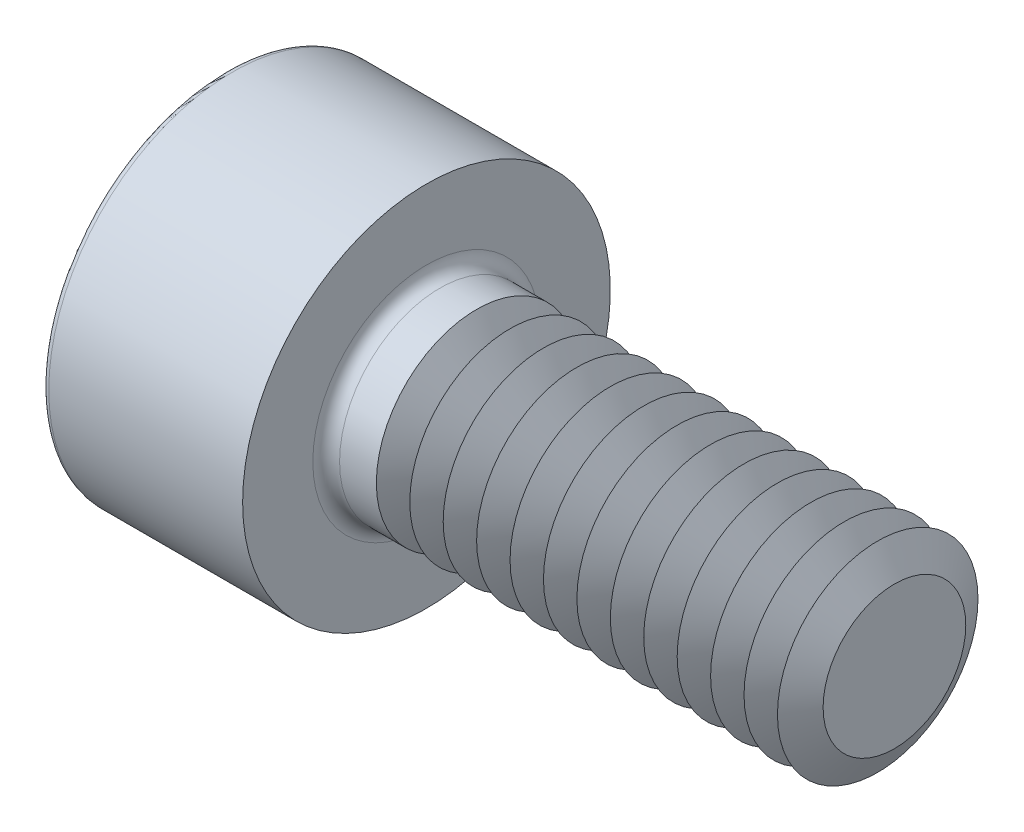
ISO-10303-21;
HEADER;
FILE_DESCRIPTION(('STEP AP214'),'2;1');
FILE_NAME('part.step','',(''),(''),'','','');
FILE_SCHEMA(('AUTOMOTIVE_DESIGN { 1 0 10303 214 1 1 1 1 }'));
ENDSEC;
DATA;
#1=APPLICATION_CONTEXT('core data for automotive mechanical design processes');
#2=APPLICATION_PROTOCOL_DEFINITION('international standard','automotive_design',2000,#1);
#3=PRODUCT_CONTEXT('',#1,'mechanical');
#4=PRODUCT('Part','Part','',(#3));
#5=PRODUCT_RELATED_PRODUCT_CATEGORY('part','',(#4));
#6=PRODUCT_DEFINITION_FORMATION('','',#4);
#7=PRODUCT_DEFINITION_CONTEXT('part definition',#1,'design');
#8=PRODUCT_DEFINITION('design','',#6,#7);
#9=PRODUCT_DEFINITION_SHAPE('','',#8);
#10=(LENGTH_UNIT() NAMED_UNIT(*) SI_UNIT(.MILLI.,.METRE.));
#11=(NAMED_UNIT(*) PLANE_ANGLE_UNIT() SI_UNIT($,.RADIAN.));
#12=(NAMED_UNIT(*) SI_UNIT($,.STERADIAN.) SOLID_ANGLE_UNIT());
#13=UNCERTAINTY_MEASURE_WITH_UNIT(LENGTH_MEASURE(1.E-05),#10,'distance_accuracy_value','');
#14=(GEOMETRIC_REPRESENTATION_CONTEXT(3) GLOBAL_UNCERTAINTY_ASSIGNED_CONTEXT((#13)) GLOBAL_UNIT_ASSIGNED_CONTEXT((#10,
#11,#12)) REPRESENTATION_CONTEXT('',''));
#15=CARTESIAN_POINT('',(0.,0.,0.));
#16=DIRECTION('',(0.,0.,1.));
#17=DIRECTION('',(1.,0.,0.));
#18=AXIS2_PLACEMENT_3D('',#15,#16,#17);
#19=CARTESIAN_POINT('',(0.,0.,0.));
#20=DIRECTION('',(-1.,0.,0.));
#21=DIRECTION('',(0.,0.,1.));
#22=AXIS2_PLACEMENT_3D('',#19,#20,#21);
#23=CYLINDRICAL_SURFACE('',#22,1.5);
#24=CARTESIAN_POINT('',(4.25000733344088,0.,0.));
#25=DIRECTION('',(-1.,0.,0.));
#26=DIRECTION('',(0.,0.,1.));
#27=AXIS2_PLACEMENT_3D('',#24,#25,#26);
#28=CIRCLE('',#27,1.5);
#29=CARTESIAN_POINT('',(4.25000733344088,0.,1.5));
#30=VERTEX_POINT('',#29);
#31=EDGE_CURVE('E332',#30,#30,#28,.T.);
#32=ORIENTED_EDGE('',*,*,#31,.T.);
#33=EDGE_LOOP('',(#32));
#34=FACE_BOUND('',#33,.T.);
#35=CARTESIAN_POINT('',(4.24999266655911,0.,0.));
#36=DIRECTION('',(-1.,0.,0.));
#37=DIRECTION('',(0.,0.,1.));
#38=AXIS2_PLACEMENT_3D('',#35,#36,#37);
#39=CIRCLE('',#38,1.5);
#40=CARTESIAN_POINT('',(4.24999266655911,0.,1.5));
#41=VERTEX_POINT('',#40);
#42=EDGE_CURVE('E328',#41,#41,#39,.T.);
#43=ORIENTED_EDGE('',*,*,#42,.F.);
#44=EDGE_LOOP('',(#43));
#45=FACE_BOUND('',#44,.T.);
#46=ADVANCED_FACE('F39',(#34,#45),#23,.T.);
#47=CARTESIAN_POINT('',(4.75000733344088,0.,0.));
#48=DIRECTION('',(-1.,0.,0.));
#49=DIRECTION('',(0.,0.,1.));
#50=AXIS2_PLACEMENT_3D('',#47,#48,#49);
#51=CIRCLE('',#50,1.5);
#52=CARTESIAN_POINT('',(4.75000733344088,0.,1.5));
#53=VERTEX_POINT('',#52);
#54=EDGE_CURVE('E345',#53,#53,#51,.T.);
#55=ORIENTED_EDGE('',*,*,#54,.T.);
#56=EDGE_LOOP('',(#55));
#57=FACE_BOUND('',#56,.T.);
#58=CARTESIAN_POINT('',(4.74999266655911,0.,0.));
#59=DIRECTION('',(-1.,0.,0.));
#60=DIRECTION('',(0.,0.,1.));
#61=AXIS2_PLACEMENT_3D('',#58,#59,#60);
#62=CIRCLE('',#61,1.5);
#63=CARTESIAN_POINT('',(4.74999266655911,0.,1.5));
#64=VERTEX_POINT('',#63);
#65=EDGE_CURVE('E334',#64,#64,#62,.T.);
#66=ORIENTED_EDGE('',*,*,#65,.F.);
#67=EDGE_LOOP('',(#66));
#68=FACE_BOUND('',#67,.T.);
#69=ADVANCED_FACE('F178',(#57,#68),#23,.T.);
#70=CARTESIAN_POINT('',(5.25000733344088,0.,0.));
#71=DIRECTION('',(-1.,0.,0.));
#72=DIRECTION('',(0.,0.,1.));
#73=AXIS2_PLACEMENT_3D('',#70,#71,#72);
#74=CIRCLE('',#73,1.5);
#75=CARTESIAN_POINT('',(5.25000733344088,0.,1.5));
#76=VERTEX_POINT('',#75);
#77=EDGE_CURVE('E354',#76,#76,#74,.T.);
#78=ORIENTED_EDGE('',*,*,#77,.T.);
#79=EDGE_LOOP('',(#78));
#80=FACE_BOUND('',#79,.T.);
#81=CARTESIAN_POINT('',(5.24999266655911,0.,0.));
#82=DIRECTION('',(-1.,0.,0.));
#83=DIRECTION('',(0.,0.,1.));
#84=AXIS2_PLACEMENT_3D('',#81,#82,#83);
#85=CIRCLE('',#84,1.5);
#86=CARTESIAN_POINT('',(5.24999266655911,0.,1.5));
#87=VERTEX_POINT('',#86);
#88=EDGE_CURVE('E348',#87,#87,#85,.T.);
#89=ORIENTED_EDGE('',*,*,#88,.F.);
#90=EDGE_LOOP('',(#89));
#91=FACE_BOUND('',#90,.T.);
#92=ADVANCED_FACE('F183',(#80,#91),#23,.T.);
#93=CARTESIAN_POINT('',(5.75000733344088,0.,0.));
#94=DIRECTION('',(-1.,0.,0.));
#95=DIRECTION('',(0.,0.,1.));
#96=AXIS2_PLACEMENT_3D('',#93,#94,#95);
#97=CIRCLE('',#96,1.5);
#98=CARTESIAN_POINT('',(5.75000733344088,0.,1.5));
#99=VERTEX_POINT('',#98);
#100=EDGE_CURVE('E363',#99,#99,#97,.T.);
#101=ORIENTED_EDGE('',*,*,#100,.T.);
#102=EDGE_LOOP('',(#101));
#103=FACE_BOUND('',#102,.T.);
#104=CARTESIAN_POINT('',(5.74999266655911,0.,0.));
#105=DIRECTION('',(-1.,0.,0.));
#106=DIRECTION('',(0.,0.,1.));
#107=AXIS2_PLACEMENT_3D('',#104,#105,#106);
#108=CIRCLE('',#107,1.5);
#109=CARTESIAN_POINT('',(5.74999266655911,0.,1.5));
#110=VERTEX_POINT('',#109);
#111=EDGE_CURVE('E357',#110,#110,#108,.T.);
#112=ORIENTED_EDGE('',*,*,#111,.F.);
#113=EDGE_LOOP('',(#112));
#114=FACE_BOUND('',#113,.T.);
#115=ADVANCED_FACE('F508',(#103,#114),#23,.T.);
#116=CARTESIAN_POINT('',(6.25000733344088,0.,0.));
#117=DIRECTION('',(-1.,0.,0.));
#118=DIRECTION('',(0.,0.,1.));
#119=AXIS2_PLACEMENT_3D('',#116,#117,#118);
#120=CIRCLE('',#119,1.5);
#121=CARTESIAN_POINT('',(6.25000733344088,0.,1.5));
#122=VERTEX_POINT('',#121);
#123=EDGE_CURVE('E372',#122,#122,#120,.T.);
#124=ORIENTED_EDGE('',*,*,#123,.T.);
#125=EDGE_LOOP('',(#124));
#126=FACE_BOUND('',#125,.T.);
#127=CARTESIAN_POINT('',(6.24999266655911,0.,0.));
#128=DIRECTION('',(-1.,0.,0.));
#129=DIRECTION('',(0.,0.,1.));
#130=AXIS2_PLACEMENT_3D('',#127,#128,#129);
#131=CIRCLE('',#130,1.5);
#132=CARTESIAN_POINT('',(6.24999266655911,0.,1.5));
#133=VERTEX_POINT('',#132);
#134=EDGE_CURVE('E366',#133,#133,#131,.T.);
#135=ORIENTED_EDGE('',*,*,#134,.F.);
#136=EDGE_LOOP('',(#135));
#137=FACE_BOUND('',#136,.T.);
#138=ADVANCED_FACE('F499',(#126,#137),#23,.T.);
#139=CARTESIAN_POINT('',(6.75000733344088,0.,0.));
#140=DIRECTION('',(-1.,0.,0.));
#141=DIRECTION('',(0.,0.,1.));
#142=AXIS2_PLACEMENT_3D('',#139,#140,#141);
#143=CIRCLE('',#142,1.5);
#144=CARTESIAN_POINT('',(6.75000733344088,0.,1.5));
#145=VERTEX_POINT('',#144);
#146=EDGE_CURVE('E381',#145,#145,#143,.T.);
#147=ORIENTED_EDGE('',*,*,#146,.T.);
#148=EDGE_LOOP('',(#147));
#149=FACE_BOUND('',#148,.T.);
#150=CARTESIAN_POINT('',(6.74999266655911,0.,0.));
#151=DIRECTION('',(-1.,0.,0.));
#152=DIRECTION('',(0.,0.,1.));
#153=AXIS2_PLACEMENT_3D('',#150,#151,#152);
#154=CIRCLE('',#153,1.5);
#155=CARTESIAN_POINT('',(6.74999266655911,0.,1.5));
#156=VERTEX_POINT('',#155);
#157=EDGE_CURVE('E375',#156,#156,#154,.T.);
#158=ORIENTED_EDGE('',*,*,#157,.F.);
#159=EDGE_LOOP('',(#158));
#160=FACE_BOUND('',#159,.T.);
#161=ADVANCED_FACE('F490',(#149,#160),#23,.T.);
#162=CARTESIAN_POINT('',(7.25000733344088,0.,0.));
#163=DIRECTION('',(-1.,0.,0.));
#164=DIRECTION('',(0.,0.,1.));
#165=AXIS2_PLACEMENT_3D('',#162,#163,#164);
#166=CIRCLE('',#165,1.5);
#167=CARTESIAN_POINT('',(7.25000733344088,0.,1.5));
#168=VERTEX_POINT('',#167);
#169=EDGE_CURVE('E390',#168,#168,#166,.T.);
#170=ORIENTED_EDGE('',*,*,#169,.T.);
#171=EDGE_LOOP('',(#170));
#172=FACE_BOUND('',#171,.T.);
#173=CARTESIAN_POINT('',(7.24999266655911,0.,0.));
#174=DIRECTION('',(-1.,0.,0.));
#175=DIRECTION('',(0.,0.,1.));
#176=AXIS2_PLACEMENT_3D('',#173,#174,#175);
#177=CIRCLE('',#176,1.5);
#178=CARTESIAN_POINT('',(7.24999266655911,0.,1.5));
#179=VERTEX_POINT('',#178);
#180=EDGE_CURVE('E384',#179,#179,#177,.T.);
#181=ORIENTED_EDGE('',*,*,#180,.F.);
#182=EDGE_LOOP('',(#181));
#183=FACE_BOUND('',#182,.T.);
#184=ADVANCED_FACE('F481',(#172,#183),#23,.T.);
#185=CARTESIAN_POINT('',(7.75000733344088,0.,0.));
#186=DIRECTION('',(-1.,0.,0.));
#187=DIRECTION('',(0.,0.,1.));
#188=AXIS2_PLACEMENT_3D('',#185,#186,#187);
#189=CIRCLE('',#188,1.5);
#190=CARTESIAN_POINT('',(7.75000733344088,0.,1.5));
#191=VERTEX_POINT('',#190);
#192=EDGE_CURVE('E399',#191,#191,#189,.T.);
#193=ORIENTED_EDGE('',*,*,#192,.T.);
#194=EDGE_LOOP('',(#193));
#195=FACE_BOUND('',#194,.T.);
#196=CARTESIAN_POINT('',(7.74999266655911,0.,0.));
#197=DIRECTION('',(-1.,0.,0.));
#198=DIRECTION('',(0.,0.,1.));
#199=AXIS2_PLACEMENT_3D('',#196,#197,#198);
#200=CIRCLE('',#199,1.5);
#201=CARTESIAN_POINT('',(7.74999266655911,0.,1.5));
#202=VERTEX_POINT('',#201);
#203=EDGE_CURVE('E393',#202,#202,#200,.T.);
#204=ORIENTED_EDGE('',*,*,#203,.F.);
#205=EDGE_LOOP('',(#204));
#206=FACE_BOUND('',#205,.T.);
#207=ADVANCED_FACE('F472',(#195,#206),#23,.T.);
#208=CARTESIAN_POINT('',(8.25000733344088,0.,0.));
#209=DIRECTION('',(-1.,0.,0.));
#210=DIRECTION('',(0.,0.,1.));
#211=AXIS2_PLACEMENT_3D('',#208,#209,#210);
#212=CIRCLE('',#211,1.5);
#213=CARTESIAN_POINT('',(8.25000733344088,0.,1.5));
#214=VERTEX_POINT('',#213);
#215=EDGE_CURVE('E408',#214,#214,#212,.T.);
#216=ORIENTED_EDGE('',*,*,#215,.T.);
#217=EDGE_LOOP('',(#216));
#218=FACE_BOUND('',#217,.T.);
#219=CARTESIAN_POINT('',(8.24999266655911,0.,0.));
#220=DIRECTION('',(-1.,0.,0.));
#221=DIRECTION('',(0.,0.,1.));
#222=AXIS2_PLACEMENT_3D('',#219,#220,#221);
#223=CIRCLE('',#222,1.5);
#224=CARTESIAN_POINT('',(8.24999266655911,0.,1.5));
#225=VERTEX_POINT('',#224);
#226=EDGE_CURVE('E402',#225,#225,#223,.T.);
#227=ORIENTED_EDGE('',*,*,#226,.F.);
#228=EDGE_LOOP('',(#227));
#229=FACE_BOUND('',#228,.T.);
#230=ADVANCED_FACE('F463',(#218,#229),#23,.T.);
#231=CARTESIAN_POINT('',(8.75000733344088,0.,0.));
#232=DIRECTION('',(-1.,0.,0.));
#233=DIRECTION('',(0.,0.,1.));
#234=AXIS2_PLACEMENT_3D('',#231,#232,#233);
#235=CIRCLE('',#234,1.5);
#236=CARTESIAN_POINT('',(8.75000733344088,0.,1.5));
#237=VERTEX_POINT('',#236);
#238=EDGE_CURVE('E417',#237,#237,#235,.T.);
#239=ORIENTED_EDGE('',*,*,#238,.T.);
#240=EDGE_LOOP('',(#239));
#241=FACE_BOUND('',#240,.T.);
#242=CARTESIAN_POINT('',(8.74999266655911,0.,0.));
#243=DIRECTION('',(-1.,0.,0.));
#244=DIRECTION('',(0.,0.,1.));
#245=AXIS2_PLACEMENT_3D('',#242,#243,#244);
#246=CIRCLE('',#245,1.5);
#247=CARTESIAN_POINT('',(8.74999266655911,0.,1.5));
#248=VERTEX_POINT('',#247);
#249=EDGE_CURVE('E411',#248,#248,#246,.T.);
#250=ORIENTED_EDGE('',*,*,#249,.F.);
#251=EDGE_LOOP('',(#250));
#252=FACE_BOUND('',#251,.T.);
#253=ADVANCED_FACE('F454',(#241,#252),#23,.T.);
#254=CARTESIAN_POINT('',(9.25000733344088,0.,0.));
#255=DIRECTION('',(-1.,0.,0.));
#256=DIRECTION('',(0.,0.,1.));
#257=AXIS2_PLACEMENT_3D('',#254,#255,#256);
#258=CIRCLE('',#257,1.5);
#259=CARTESIAN_POINT('',(9.25000733344088,0.,1.5));
#260=VERTEX_POINT('',#259);
#261=EDGE_CURVE('E426',#260,#260,#258,.T.);
#262=ORIENTED_EDGE('',*,*,#261,.T.);
#263=EDGE_LOOP('',(#262));
#264=FACE_BOUND('',#263,.T.);
#265=CARTESIAN_POINT('',(9.24999266655911,0.,0.));
#266=DIRECTION('',(-1.,0.,0.));
#267=DIRECTION('',(0.,0.,1.));
#268=AXIS2_PLACEMENT_3D('',#265,#266,#267);
#269=CIRCLE('',#268,1.5);
#270=CARTESIAN_POINT('',(9.24999266655911,0.,1.5));
#271=VERTEX_POINT('',#270);
#272=EDGE_CURVE('E420',#271,#271,#269,.T.);
#273=ORIENTED_EDGE('',*,*,#272,.F.);
#274=EDGE_LOOP('',(#273));
#275=FACE_BOUND('',#274,.T.);
#276=ADVANCED_FACE('F445',(#264,#275),#23,.T.);
#277=CARTESIAN_POINT('',(9.75000733344088,0.,0.));
#278=DIRECTION('',(-1.,0.,0.));
#279=DIRECTION('',(0.,0.,1.));
#280=AXIS2_PLACEMENT_3D('',#277,#278,#279);
#281=CIRCLE('',#280,1.5);
#282=CARTESIAN_POINT('',(9.75000733344088,0.,1.5));
#283=VERTEX_POINT('',#282);
#284=EDGE_CURVE('E129',#283,#283,#281,.T.);
#285=ORIENTED_EDGE('',*,*,#284,.T.);
#286=EDGE_LOOP('',(#285));
#287=FACE_BOUND('',#286,.T.);
#288=CARTESIAN_POINT('',(9.74999266655911,0.,0.));
#289=DIRECTION('',(-1.,0.,0.));
#290=DIRECTION('',(0.,0.,1.));
#291=AXIS2_PLACEMENT_3D('',#288,#289,#290);
#292=CIRCLE('',#291,1.5);
#293=CARTESIAN_POINT('',(9.74999266655911,0.,1.5));
#294=VERTEX_POINT('',#293);
#295=EDGE_CURVE('E429',#294,#294,#292,.T.);
#296=ORIENTED_EDGE('',*,*,#295,.F.);
#297=EDGE_LOOP('',(#296));
#298=FACE_BOUND('',#297,.T.);
#299=ADVANCED_FACE('F175',(#287,#298),#23,.T.);
#300=CARTESIAN_POINT('',(9.75000733344088,0.,0.));
#301=DIRECTION('',(-1.,0.,0.));
#302=DIRECTION('',(0.,0.,1.));
#303=AXIS2_PLACEMENT_3D('',#300,#301,#302);
#304=CONICAL_SURFACE('',#303,1.5,1.04719755119659);
#305=CARTESIAN_POINT('',(10.,0.,0.));
#306=DIRECTION('',(1.,0.,0.));
#307=DIRECTION('',(0.,0.,-1.));
#308=AXIS2_PLACEMENT_3D('',#305,#306,#307);
#309=CIRCLE('',#308,1.067);
#310=CARTESIAN_POINT('',(10.,0.,-1.067));
#311=VERTEX_POINT('',#310);
#312=EDGE_CURVE('E841',#311,#311,#309,.F.);
#313=ORIENTED_EDGE('',*,*,#312,.T.);
#314=EDGE_LOOP('',(#313));
#315=FACE_BOUND('',#314,.T.);
#316=ORIENTED_EDGE('',*,*,#284,.F.);
#317=EDGE_LOOP('',(#316));
#318=FACE_BOUND('',#317,.T.);
#319=ADVANCED_FACE('F225',(#315,#318),#304,.T.);
#320=CARTESIAN_POINT('',(9.25000733344088,0.,0.));
#321=DIRECTION('',(-1.,0.,0.));
#322=DIRECTION('',(0.,0.,1.));
#323=AXIS2_PLACEMENT_3D('',#320,#321,#322);
#324=CONICAL_SURFACE('',#323,1.5,1.04719755119659);
#325=CARTESIAN_POINT('',(9.5,0.,0.));
#326=DIRECTION('',(-1.,0.,0.));
#327=DIRECTION('',(0.,0.,1.));
#328=AXIS2_PLACEMENT_3D('',#325,#326,#327);
#329=CIRCLE('',#328,1.067);
#330=CARTESIAN_POINT('',(9.5,0.,1.067));
#331=VERTEX_POINT('',#330);
#332=EDGE_CURVE('E432',#331,#331,#329,.T.);
#333=ORIENTED_EDGE('',*,*,#332,.T.);
#334=EDGE_LOOP('',(#333));
#335=FACE_BOUND('',#334,.T.);
#336=ORIENTED_EDGE('',*,*,#261,.F.);
#337=EDGE_LOOP('',(#336));
#338=FACE_BOUND('',#337,.T.);
#339=ADVANCED_FACE('F228',(#335,#338),#324,.T.);
#340=CARTESIAN_POINT('',(9.5,0.,0.));
#341=DIRECTION('',(1.,0.,0.));
#342=DIRECTION('',(0.,0.,-1.));
#343=AXIS2_PLACEMENT_3D('',#340,#341,#342);
#344=CONICAL_SURFACE('',#343,1.067,1.04719755119659);
#345=ORIENTED_EDGE('',*,*,#295,.T.);
#346=EDGE_LOOP('',(#345));
#347=FACE_BOUND('',#346,.T.);
#348=ORIENTED_EDGE('',*,*,#332,.F.);
#349=EDGE_LOOP('',(#348));
#350=FACE_BOUND('',#349,.T.);
#351=ADVANCED_FACE('F232',(#347,#350),#344,.T.);
#352=CARTESIAN_POINT('',(8.75000733344088,0.,0.));
#353=DIRECTION('',(-1.,0.,0.));
#354=DIRECTION('',(0.,0.,1.));
#355=AXIS2_PLACEMENT_3D('',#352,#353,#354);
#356=CONICAL_SURFACE('',#355,1.5,1.04719755119659);
#357=CARTESIAN_POINT('',(9.,0.,0.));
#358=DIRECTION('',(-1.,0.,0.));
#359=DIRECTION('',(0.,0.,1.));
#360=AXIS2_PLACEMENT_3D('',#357,#358,#359);
#361=CIRCLE('',#360,1.067);
#362=CARTESIAN_POINT('',(9.,0.,1.067));
#363=VERTEX_POINT('',#362);
#364=EDGE_CURVE('E423',#363,#363,#361,.T.);
#365=ORIENTED_EDGE('',*,*,#364,.T.);
#366=EDGE_LOOP('',(#365));
#367=FACE_BOUND('',#366,.T.);
#368=ORIENTED_EDGE('',*,*,#238,.F.);
#369=EDGE_LOOP('',(#368));
#370=FACE_BOUND('',#369,.T.);
#371=ADVANCED_FACE('F236',(#367,#370),#356,.T.);
#372=CARTESIAN_POINT('',(9.,0.,0.));
#373=DIRECTION('',(1.,0.,0.));
#374=DIRECTION('',(0.,0.,-1.));
#375=AXIS2_PLACEMENT_3D('',#372,#373,#374);
#376=CONICAL_SURFACE('',#375,1.067,1.04719755119659);
#377=ORIENTED_EDGE('',*,*,#272,.T.);
#378=EDGE_LOOP('',(#377));
#379=FACE_BOUND('',#378,.T.);
#380=ORIENTED_EDGE('',*,*,#364,.F.);
#381=EDGE_LOOP('',(#380));
#382=FACE_BOUND('',#381,.T.);
#383=ADVANCED_FACE('F240',(#379,#382),#376,.T.);
#384=CARTESIAN_POINT('',(8.25000733344088,0.,0.));
#385=DIRECTION('',(-1.,0.,0.));
#386=DIRECTION('',(0.,0.,1.));
#387=AXIS2_PLACEMENT_3D('',#384,#385,#386);
#388=CONICAL_SURFACE('',#387,1.5,1.04719755119659);
#389=CARTESIAN_POINT('',(8.49999999999999,0.,0.));
#390=DIRECTION('',(-1.,0.,0.));
#391=DIRECTION('',(0.,0.,1.));
#392=AXIS2_PLACEMENT_3D('',#389,#390,#391);
#393=CIRCLE('',#392,1.067);
#394=CARTESIAN_POINT('',(8.49999999999999,0.,1.067));
#395=VERTEX_POINT('',#394);
#396=EDGE_CURVE('E414',#395,#395,#393,.T.);
#397=ORIENTED_EDGE('',*,*,#396,.T.);
#398=EDGE_LOOP('',(#397));
#399=FACE_BOUND('',#398,.T.);
#400=ORIENTED_EDGE('',*,*,#215,.F.);
#401=EDGE_LOOP('',(#400));
#402=FACE_BOUND('',#401,.T.);
#403=ADVANCED_FACE('F244',(#399,#402),#388,.T.);
#404=CARTESIAN_POINT('',(8.49999999999999,0.,0.));
#405=DIRECTION('',(1.,0.,0.));
#406=DIRECTION('',(0.,0.,-1.));
#407=AXIS2_PLACEMENT_3D('',#404,#405,#406);
#408=CONICAL_SURFACE('',#407,1.067,1.04719755119659);
#409=ORIENTED_EDGE('',*,*,#249,.T.);
#410=EDGE_LOOP('',(#409));
#411=FACE_BOUND('',#410,.T.);
#412=ORIENTED_EDGE('',*,*,#396,.F.);
#413=EDGE_LOOP('',(#412));
#414=FACE_BOUND('',#413,.T.);
#415=ADVANCED_FACE('F248',(#411,#414),#408,.T.);
#416=CARTESIAN_POINT('',(7.75000733344088,0.,0.));
#417=DIRECTION('',(-1.,0.,0.));
#418=DIRECTION('',(0.,0.,1.));
#419=AXIS2_PLACEMENT_3D('',#416,#417,#418);
#420=CONICAL_SURFACE('',#419,1.5,1.04719755119659);
#421=CARTESIAN_POINT('',(8.,0.,0.));
#422=DIRECTION('',(-1.,0.,0.));
#423=DIRECTION('',(0.,0.,1.));
#424=AXIS2_PLACEMENT_3D('',#421,#422,#423);
#425=CIRCLE('',#424,1.067);
#426=CARTESIAN_POINT('',(8.,0.,1.067));
#427=VERTEX_POINT('',#426);
#428=EDGE_CURVE('E405',#427,#427,#425,.T.);
#429=ORIENTED_EDGE('',*,*,#428,.T.);
#430=EDGE_LOOP('',(#429));
#431=FACE_BOUND('',#430,.T.);
#432=ORIENTED_EDGE('',*,*,#192,.F.);
#433=EDGE_LOOP('',(#432));
#434=FACE_BOUND('',#433,.T.);
#435=ADVANCED_FACE('F252',(#431,#434),#420,.T.);
#436=CARTESIAN_POINT('',(8.,0.,0.));
#437=DIRECTION('',(1.,0.,0.));
#438=DIRECTION('',(0.,0.,-1.));
#439=AXIS2_PLACEMENT_3D('',#436,#437,#438);
#440=CONICAL_SURFACE('',#439,1.067,1.04719755119659);
#441=ORIENTED_EDGE('',*,*,#226,.T.);
#442=EDGE_LOOP('',(#441));
#443=FACE_BOUND('',#442,.T.);
#444=ORIENTED_EDGE('',*,*,#428,.F.);
#445=EDGE_LOOP('',(#444));
#446=FACE_BOUND('',#445,.T.);
#447=ADVANCED_FACE('F256',(#443,#446),#440,.T.);
#448=CARTESIAN_POINT('',(7.25000733344088,0.,0.));
#449=DIRECTION('',(-1.,0.,0.));
#450=DIRECTION('',(0.,0.,1.));
#451=AXIS2_PLACEMENT_3D('',#448,#449,#450);
#452=CONICAL_SURFACE('',#451,1.5,1.04719755119659);
#453=CARTESIAN_POINT('',(7.5,0.,0.));
#454=DIRECTION('',(-1.,0.,0.));
#455=DIRECTION('',(0.,0.,1.));
#456=AXIS2_PLACEMENT_3D('',#453,#454,#455);
#457=CIRCLE('',#456,1.067);
#458=CARTESIAN_POINT('',(7.5,0.,1.067));
#459=VERTEX_POINT('',#458);
#460=EDGE_CURVE('E396',#459,#459,#457,.T.);
#461=ORIENTED_EDGE('',*,*,#460,.T.);
#462=EDGE_LOOP('',(#461));
#463=FACE_BOUND('',#462,.T.);
#464=ORIENTED_EDGE('',*,*,#169,.F.);
#465=EDGE_LOOP('',(#464));
#466=FACE_BOUND('',#465,.T.);
#467=ADVANCED_FACE('F260',(#463,#466),#452,.T.);
#468=CARTESIAN_POINT('',(7.5,0.,0.));
#469=DIRECTION('',(1.,0.,0.));
#470=DIRECTION('',(0.,0.,-1.));
#471=AXIS2_PLACEMENT_3D('',#468,#469,#470);
#472=CONICAL_SURFACE('',#471,1.067,1.04719755119659);
#473=ORIENTED_EDGE('',*,*,#203,.T.);
#474=EDGE_LOOP('',(#473));
#475=FACE_BOUND('',#474,.T.);
#476=ORIENTED_EDGE('',*,*,#460,.F.);
#477=EDGE_LOOP('',(#476));
#478=FACE_BOUND('',#477,.T.);
#479=ADVANCED_FACE('F264',(#475,#478),#472,.T.);
#480=CARTESIAN_POINT('',(6.75000733344088,0.,0.));
#481=DIRECTION('',(-1.,0.,0.));
#482=DIRECTION('',(0.,0.,1.));
#483=AXIS2_PLACEMENT_3D('',#480,#481,#482);
#484=CONICAL_SURFACE('',#483,1.5,1.04719755119659);
#485=CARTESIAN_POINT('',(7.,0.,0.));
#486=DIRECTION('',(-1.,0.,0.));
#487=DIRECTION('',(0.,0.,1.));
#488=AXIS2_PLACEMENT_3D('',#485,#486,#487);
#489=CIRCLE('',#488,1.067);
#490=CARTESIAN_POINT('',(7.,0.,1.067));
#491=VERTEX_POINT('',#490);
#492=EDGE_CURVE('E387',#491,#491,#489,.T.);
#493=ORIENTED_EDGE('',*,*,#492,.T.);
#494=EDGE_LOOP('',(#493));
#495=FACE_BOUND('',#494,.T.);
#496=ORIENTED_EDGE('',*,*,#146,.F.);
#497=EDGE_LOOP('',(#496));
#498=FACE_BOUND('',#497,.T.);
#499=ADVANCED_FACE('F268',(#495,#498),#484,.T.);
#500=CARTESIAN_POINT('',(7.,0.,0.));
#501=DIRECTION('',(1.,0.,0.));
#502=DIRECTION('',(0.,0.,-1.));
#503=AXIS2_PLACEMENT_3D('',#500,#501,#502);
#504=CONICAL_SURFACE('',#503,1.067,1.04719755119659);
#505=ORIENTED_EDGE('',*,*,#180,.T.);
#506=EDGE_LOOP('',(#505));
#507=FACE_BOUND('',#506,.T.);
#508=ORIENTED_EDGE('',*,*,#492,.F.);
#509=EDGE_LOOP('',(#508));
#510=FACE_BOUND('',#509,.T.);
#511=ADVANCED_FACE('F272',(#507,#510),#504,.T.);
#512=CARTESIAN_POINT('',(6.25000733344088,0.,0.));
#513=DIRECTION('',(-1.,0.,0.));
#514=DIRECTION('',(0.,0.,1.));
#515=AXIS2_PLACEMENT_3D('',#512,#513,#514);
#516=CONICAL_SURFACE('',#515,1.5,1.04719755119659);
#517=CARTESIAN_POINT('',(6.5,0.,0.));
#518=DIRECTION('',(-1.,0.,0.));
#519=DIRECTION('',(0.,0.,1.));
#520=AXIS2_PLACEMENT_3D('',#517,#518,#519);
#521=CIRCLE('',#520,1.067);
#522=CARTESIAN_POINT('',(6.5,0.,1.067));
#523=VERTEX_POINT('',#522);
#524=EDGE_CURVE('E378',#523,#523,#521,.T.);
#525=ORIENTED_EDGE('',*,*,#524,.T.);
#526=EDGE_LOOP('',(#525));
#527=FACE_BOUND('',#526,.T.);
#528=ORIENTED_EDGE('',*,*,#123,.F.);
#529=EDGE_LOOP('',(#528));
#530=FACE_BOUND('',#529,.T.);
#531=ADVANCED_FACE('F276',(#527,#530),#516,.T.);
#532=CARTESIAN_POINT('',(6.5,0.,0.));
#533=DIRECTION('',(1.,0.,0.));
#534=DIRECTION('',(0.,0.,-1.));
#535=AXIS2_PLACEMENT_3D('',#532,#533,#534);
#536=CONICAL_SURFACE('',#535,1.067,1.04719755119659);
#537=ORIENTED_EDGE('',*,*,#157,.T.);
#538=EDGE_LOOP('',(#537));
#539=FACE_BOUND('',#538,.T.);
#540=ORIENTED_EDGE('',*,*,#524,.F.);
#541=EDGE_LOOP('',(#540));
#542=FACE_BOUND('',#541,.T.);
#543=ADVANCED_FACE('F280',(#539,#542),#536,.T.);
#544=CARTESIAN_POINT('',(5.75000733344088,0.,0.));
#545=DIRECTION('',(-1.,0.,0.));
#546=DIRECTION('',(0.,0.,1.));
#547=AXIS2_PLACEMENT_3D('',#544,#545,#546);
#548=CONICAL_SURFACE('',#547,1.5,1.04719755119659);
#549=CARTESIAN_POINT('',(5.99999999999999,0.,0.));
#550=DIRECTION('',(-1.,0.,0.));
#551=DIRECTION('',(0.,0.,1.));
#552=AXIS2_PLACEMENT_3D('',#549,#550,#551);
#553=CIRCLE('',#552,1.067);
#554=CARTESIAN_POINT('',(5.99999999999999,0.,1.067));
#555=VERTEX_POINT('',#554);
#556=EDGE_CURVE('E369',#555,#555,#553,.T.);
#557=ORIENTED_EDGE('',*,*,#556,.T.);
#558=EDGE_LOOP('',(#557));
#559=FACE_BOUND('',#558,.T.);
#560=ORIENTED_EDGE('',*,*,#100,.F.);
#561=EDGE_LOOP('',(#560));
#562=FACE_BOUND('',#561,.T.);
#563=ADVANCED_FACE('F284',(#559,#562),#548,.T.);
#564=CARTESIAN_POINT('',(5.99999999999999,0.,0.));
#565=DIRECTION('',(1.,0.,0.));
#566=DIRECTION('',(0.,0.,-1.));
#567=AXIS2_PLACEMENT_3D('',#564,#565,#566);
#568=CONICAL_SURFACE('',#567,1.067,1.04719755119659);
#569=ORIENTED_EDGE('',*,*,#134,.T.);
#570=EDGE_LOOP('',(#569));
#571=FACE_BOUND('',#570,.T.);
#572=ORIENTED_EDGE('',*,*,#556,.F.);
#573=EDGE_LOOP('',(#572));
#574=FACE_BOUND('',#573,.T.);
#575=ADVANCED_FACE('F288',(#571,#574),#568,.T.);
#576=CARTESIAN_POINT('',(5.25000733344088,0.,0.));
#577=DIRECTION('',(-1.,0.,0.));
#578=DIRECTION('',(0.,0.,1.));
#579=AXIS2_PLACEMENT_3D('',#576,#577,#578);
#580=CONICAL_SURFACE('',#579,1.5,1.04719755119659);
#581=CARTESIAN_POINT('',(5.5,0.,0.));
#582=DIRECTION('',(-1.,0.,0.));
#583=DIRECTION('',(0.,0.,1.));
#584=AXIS2_PLACEMENT_3D('',#581,#582,#583);
#585=CIRCLE('',#584,1.067);
#586=CARTESIAN_POINT('',(5.5,0.,1.067));
#587=VERTEX_POINT('',#586);
#588=EDGE_CURVE('E360',#587,#587,#585,.T.);
#589=ORIENTED_EDGE('',*,*,#588,.T.);
#590=EDGE_LOOP('',(#589));
#591=FACE_BOUND('',#590,.T.);
#592=ORIENTED_EDGE('',*,*,#77,.F.);
#593=EDGE_LOOP('',(#592));
#594=FACE_BOUND('',#593,.T.);
#595=ADVANCED_FACE('F292',(#591,#594),#580,.T.);
#596=CARTESIAN_POINT('',(5.5,0.,0.));
#597=DIRECTION('',(1.,0.,0.));
#598=DIRECTION('',(0.,0.,-1.));
#599=AXIS2_PLACEMENT_3D('',#596,#597,#598);
#600=CONICAL_SURFACE('',#599,1.067,1.04719755119659);
#601=ORIENTED_EDGE('',*,*,#111,.T.);
#602=EDGE_LOOP('',(#601));
#603=FACE_BOUND('',#602,.T.);
#604=ORIENTED_EDGE('',*,*,#588,.F.);
#605=EDGE_LOOP('',(#604));
#606=FACE_BOUND('',#605,.T.);
#607=ADVANCED_FACE('F296',(#603,#606),#600,.T.);
#608=CARTESIAN_POINT('',(4.75000733344088,0.,0.));
#609=DIRECTION('',(-1.,0.,0.));
#610=DIRECTION('',(0.,0.,1.));
#611=AXIS2_PLACEMENT_3D('',#608,#609,#610);
#612=CONICAL_SURFACE('',#611,1.5,1.04719755119659);
#613=CARTESIAN_POINT('',(5.,0.,0.));
#614=DIRECTION('',(-1.,0.,0.));
#615=DIRECTION('',(0.,0.,1.));
#616=AXIS2_PLACEMENT_3D('',#613,#614,#615);
#617=CIRCLE('',#616,1.067);
#618=CARTESIAN_POINT('',(5.,0.,1.067));
#619=VERTEX_POINT('',#618);
#620=EDGE_CURVE('E351',#619,#619,#617,.T.);
#621=ORIENTED_EDGE('',*,*,#620,.T.);
#622=EDGE_LOOP('',(#621));
#623=FACE_BOUND('',#622,.T.);
#624=ORIENTED_EDGE('',*,*,#54,.F.);
#625=EDGE_LOOP('',(#624));
#626=FACE_BOUND('',#625,.T.);
#627=ADVANCED_FACE('F300',(#623,#626),#612,.T.);
#628=CARTESIAN_POINT('',(5.,0.,0.));
#629=DIRECTION('',(1.,0.,0.));
#630=DIRECTION('',(0.,0.,-1.));
#631=AXIS2_PLACEMENT_3D('',#628,#629,#630);
#632=CONICAL_SURFACE('',#631,1.067,1.04719755119659);
#633=ORIENTED_EDGE('',*,*,#88,.T.);
#634=EDGE_LOOP('',(#633));
#635=FACE_BOUND('',#634,.T.);
#636=ORIENTED_EDGE('',*,*,#620,.F.);
#637=EDGE_LOOP('',(#636));
#638=FACE_BOUND('',#637,.T.);
#639=ADVANCED_FACE('F304',(#635,#638),#632,.T.);
#640=CARTESIAN_POINT('',(4.25000733344088,0.,0.));
#641=DIRECTION('',(-1.,0.,0.));
#642=DIRECTION('',(0.,0.,1.));
#643=AXIS2_PLACEMENT_3D('',#640,#641,#642);
#644=CONICAL_SURFACE('',#643,1.5,1.04719755119659);
#645=CARTESIAN_POINT('',(4.5,0.,0.));
#646=DIRECTION('',(-1.,0.,0.));
#647=DIRECTION('',(0.,0.,1.));
#648=AXIS2_PLACEMENT_3D('',#645,#646,#647);
#649=CIRCLE('',#648,1.067);
#650=CARTESIAN_POINT('',(4.5,0.,1.067));
#651=VERTEX_POINT('',#650);
#652=EDGE_CURVE('E342',#651,#651,#649,.T.);
#653=ORIENTED_EDGE('',*,*,#652,.T.);
#654=EDGE_LOOP('',(#653));
#655=FACE_BOUND('',#654,.T.);
#656=ORIENTED_EDGE('',*,*,#31,.F.);
#657=EDGE_LOOP('',(#656));
#658=FACE_BOUND('',#657,.T.);
#659=ADVANCED_FACE('F308',(#655,#658),#644,.T.);
#660=CARTESIAN_POINT('',(4.5,0.,0.));
#661=DIRECTION('',(1.,0.,0.));
#662=DIRECTION('',(0.,0.,-1.));
#663=AXIS2_PLACEMENT_3D('',#660,#661,#662);
#664=CONICAL_SURFACE('',#663,1.067,1.04719755119659);
#665=ORIENTED_EDGE('',*,*,#65,.T.);
#666=EDGE_LOOP('',(#665));
#667=FACE_BOUND('',#666,.T.);
#668=ORIENTED_EDGE('',*,*,#652,.F.);
#669=EDGE_LOOP('',(#668));
#670=FACE_BOUND('',#669,.T.);
#671=ADVANCED_FACE('F312',(#667,#670),#664,.T.);
#672=CARTESIAN_POINT('',(3.75000733344088,0.,0.));
#673=DIRECTION('',(-1.,0.,0.));
#674=DIRECTION('',(0.,0.,1.));
#675=AXIS2_PLACEMENT_3D('',#672,#673,#674);
#676=CONICAL_SURFACE('',#675,1.5,1.04719755119659);
#677=CARTESIAN_POINT('',(4.,0.,0.));
#678=DIRECTION('',(-1.,0.,0.));
#679=DIRECTION('',(0.,0.,1.));
#680=AXIS2_PLACEMENT_3D('',#677,#678,#679);
#681=CIRCLE('',#680,1.067);
#682=CARTESIAN_POINT('',(4.,0.,1.067));
#683=VERTEX_POINT('',#682);
#684=EDGE_CURVE('E331',#683,#683,#681,.T.);
#685=ORIENTED_EDGE('',*,*,#684,.T.);
#686=EDGE_LOOP('',(#685));
#687=FACE_BOUND('',#686,.T.);
#688=CARTESIAN_POINT('',(3.75000733344088,0.,0.));
#689=DIRECTION('',(-1.,0.,0.));
#690=DIRECTION('',(0.,0.,1.));
#691=AXIS2_PLACEMENT_3D('',#688,#689,#690);
#692=CIRCLE('',#691,1.5);
#693=CARTESIAN_POINT('',(3.75000733344088,0.,1.5));
#694=VERTEX_POINT('',#693);
#695=EDGE_CURVE('E336',#694,#694,#692,.T.);
#696=ORIENTED_EDGE('',*,*,#695,.F.);
#697=EDGE_LOOP('',(#696));
#698=FACE_BOUND('',#697,.T.);
#699=ADVANCED_FACE('F316',(#687,#698),#676,.T.);
#700=CARTESIAN_POINT('',(4.,0.,0.));
#701=DIRECTION('',(1.,0.,0.));
#702=DIRECTION('',(0.,0.,-1.));
#703=AXIS2_PLACEMENT_3D('',#700,#701,#702);
#704=CONICAL_SURFACE('',#703,1.067,1.04719755119659);
#705=ORIENTED_EDGE('',*,*,#42,.T.);
#706=EDGE_LOOP('',(#705));
#707=FACE_BOUND('',#706,.T.);
#708=ORIENTED_EDGE('',*,*,#684,.F.);
#709=EDGE_LOOP('',(#708));
#710=FACE_BOUND('',#709,.T.);
#711=ADVANCED_FACE('F224',(#707,#710),#704,.T.);
#712=CARTESIAN_POINT('',(1.3,-1.24274645443067,0.7175));
#713=DIRECTION('',(1.,0.,0.));
#714=DIRECTION('',(0.,0.,-1.));
#715=AXIS2_PLACEMENT_3D('',#712,#713,#714);
#716=PLANE('',#715);
#717=DIRECTION('',(0.,0.866025403784439,0.5));
#718=VECTOR('',#717,1.);
#719=CARTESIAN_POINT('',(1.3,-1.24274645443067,0.7175));
#720=LINE('',#719,#718);
#721=CARTESIAN_POINT('',(1.3,-1.24274645443067,0.7175));
#722=VERTEX_POINT('',#721);
#723=CARTESIAN_POINT('',(1.3,0.,1.435));
#724=VERTEX_POINT('',#723);
#725=EDGE_CURVE('E140',#722,#724,#720,.T.);
#726=ORIENTED_EDGE('',*,*,#725,.T.);
#727=DIRECTION('',(0.,0.866025403784439,-0.5));
#728=VECTOR('',#727,1.);
#729=CARTESIAN_POINT('',(1.3,0.,1.435));
#730=LINE('',#729,#728);
#731=CARTESIAN_POINT('',(1.3,1.24274645443067,0.717499999999999));
#732=VERTEX_POINT('',#731);
#733=EDGE_CURVE('E122',#724,#732,#730,.T.);
#734=ORIENTED_EDGE('',*,*,#733,.T.);
#735=DIRECTION('',(0.,0.,-1.));
#736=VECTOR('',#735,1.);
#737=CARTESIAN_POINT('',(1.3,1.24274645443067,0.717499999999999));
#738=LINE('',#737,#736);
#739=CARTESIAN_POINT('',(1.3,1.24274645443067,-0.7175));
#740=VERTEX_POINT('',#739);
#741=EDGE_CURVE('E120',#732,#740,#738,.T.);
#742=ORIENTED_EDGE('',*,*,#741,.T.);
#743=DIRECTION('',(0.,-0.866025403784439,-0.5));
#744=VECTOR('',#743,1.);
#745=CARTESIAN_POINT('',(1.3,1.24274645443067,-0.7175));
#746=LINE('',#745,#744);
#747=CARTESIAN_POINT('',(1.3,0.,-1.435));
#748=VERTEX_POINT('',#747);
#749=EDGE_CURVE('E99',#740,#748,#746,.T.);
#750=ORIENTED_EDGE('',*,*,#749,.T.);
#751=DIRECTION('',(0.,-0.866025403784439,0.5));
#752=VECTOR('',#751,1.);
#753=CARTESIAN_POINT('',(1.3,0.,-1.435));
#754=LINE('',#753,#752);
#755=CARTESIAN_POINT('',(1.3,-1.24274645443067,-0.7175));
#756=VERTEX_POINT('',#755);
#757=EDGE_CURVE('E110',#748,#756,#754,.T.);
#758=ORIENTED_EDGE('',*,*,#757,.T.);
#759=DIRECTION('',(0.,0.,1.));
#760=VECTOR('',#759,1.);
#761=CARTESIAN_POINT('',(1.3,-1.24274645443067,-0.7175));
#762=LINE('',#761,#760);
#763=EDGE_CURVE('E114',#756,#722,#762,.T.);
#764=ORIENTED_EDGE('',*,*,#763,.T.);
#765=EDGE_LOOP('',(#726,#734,#742,#750,#758,#764));
#766=FACE_BOUND('',#765,.T.);
#767=ADVANCED_FACE('F117',(#766),#716,.F.);
#768=CARTESIAN_POINT('',(1.3,1.24274645443067,0.717499999999999));
#769=DIRECTION('',(0.,1.,0.));
#770=DIRECTION('',(0.,0.,1.));
#771=AXIS2_PLACEMENT_3D('',#768,#769,#770);
#772=PLANE('',#771);
#773=DIRECTION('',(0.,0.,-1.));
#774=VECTOR('',#773,1.);
#775=CARTESIAN_POINT('',(0.,1.24274645443067,0.717499999999999));
#776=LINE('',#775,#774);
#777=CARTESIAN_POINT('',(0.,1.24274645443067,0.717499999999999));
#778=VERTEX_POINT('',#777);
#779=CARTESIAN_POINT('',(0.,1.24274645443067,-0.7175));
#780=VERTEX_POINT('',#779);
#781=EDGE_CURVE('E132',#778,#780,#776,.T.);
#782=ORIENTED_EDGE('',*,*,#781,.T.);
#783=DIRECTION('',(-1.,0.,0.));
#784=VECTOR('',#783,1.);
#785=CARTESIAN_POINT('',(1.3,1.24274645443067,-0.7175));
#786=LINE('',#785,#784);
#787=EDGE_CURVE('E107',#740,#780,#786,.T.);
#788=ORIENTED_EDGE('',*,*,#787,.F.);
#789=ORIENTED_EDGE('',*,*,#741,.F.);
#790=DIRECTION('',(-1.,0.,0.));
#791=VECTOR('',#790,1.);
#792=CARTESIAN_POINT('',(1.3,1.24274645443067,0.717499999999999));
#793=LINE('',#792,#791);
#794=EDGE_CURVE('E145',#732,#778,#793,.T.);
#795=ORIENTED_EDGE('',*,*,#794,.T.);
#796=EDGE_LOOP('',(#782,#788,#789,#795));
#797=FACE_BOUND('',#796,.T.);
#798=ADVANCED_FACE('F212',(#797),#772,.F.);
#799=CARTESIAN_POINT('',(1.3,1.24274645443067,-0.7175));
#800=DIRECTION('',(0.,0.5,-0.866025403784439));
#801=DIRECTION('',(0.,0.866025403784439,0.5));
#802=AXIS2_PLACEMENT_3D('',#799,#800,#801);
#803=PLANE('',#802);
#804=DIRECTION('',(0.,-0.866025403784439,-0.5));
#805=VECTOR('',#804,1.);
#806=CARTESIAN_POINT('',(0.,1.24274645443067,-0.7175));
#807=LINE('',#806,#805);
#808=CARTESIAN_POINT('',(0.,0.,-1.435));
#809=VERTEX_POINT('',#808);
#810=EDGE_CURVE('E102',#780,#809,#807,.T.);
#811=ORIENTED_EDGE('',*,*,#810,.T.);
#812=DIRECTION('',(-1.,0.,0.));
#813=VECTOR('',#812,1.);
#814=CARTESIAN_POINT('',(1.3,0.,-1.435));
#815=LINE('',#814,#813);
#816=EDGE_CURVE('E95',#748,#809,#815,.T.);
#817=ORIENTED_EDGE('',*,*,#816,.F.);
#818=ORIENTED_EDGE('',*,*,#749,.F.);
#819=ORIENTED_EDGE('',*,*,#787,.T.);
#820=EDGE_LOOP('',(#811,#817,#818,#819));
#821=FACE_BOUND('',#820,.T.);
#822=ADVANCED_FACE('F97',(#821),#803,.F.);
#823=CARTESIAN_POINT('',(1.3,0.,-1.435));
#824=DIRECTION('',(0.,-0.5,-0.866025403784439));
#825=DIRECTION('',(0.,0.866025403784439,-0.5));
#826=AXIS2_PLACEMENT_3D('',#823,#824,#825);
#827=PLANE('',#826);
#828=DIRECTION('',(0.,-0.866025403784439,0.5));
#829=VECTOR('',#828,1.);
#830=CARTESIAN_POINT('',(0.,0.,-1.435));
#831=LINE('',#830,#829);
#832=CARTESIAN_POINT('',(0.,-1.24274645443067,-0.7175));
#833=VERTEX_POINT('',#832);
#834=EDGE_CURVE('E136',#809,#833,#831,.T.);
#835=ORIENTED_EDGE('',*,*,#834,.T.);
#836=DIRECTION('',(-1.,0.,0.));
#837=VECTOR('',#836,1.);
#838=CARTESIAN_POINT('',(1.3,-1.24274645443067,-0.7175));
#839=LINE('',#838,#837);
#840=EDGE_CURVE('E106',#756,#833,#839,.T.);
#841=ORIENTED_EDGE('',*,*,#840,.F.);
#842=ORIENTED_EDGE('',*,*,#757,.F.);
#843=ORIENTED_EDGE('',*,*,#816,.T.);
#844=EDGE_LOOP('',(#835,#841,#842,#843));
#845=FACE_BOUND('',#844,.T.);
#846=ADVANCED_FACE('F111',(#845),#827,.F.);
#847=CARTESIAN_POINT('',(1.3,-1.24274645443067,-0.7175));
#848=DIRECTION('',(0.,-1.,0.));
#849=DIRECTION('',(0.,0.,-1.));
#850=AXIS2_PLACEMENT_3D('',#847,#848,#849);
#851=PLANE('',#850);
#852=DIRECTION('',(0.,0.,1.));
#853=VECTOR('',#852,1.);
#854=CARTESIAN_POINT('',(0.,-1.24274645443067,-0.7175));
#855=LINE('',#854,#853);
#856=CARTESIAN_POINT('',(0.,-1.24274645443067,0.7175));
#857=VERTEX_POINT('',#856);
#858=EDGE_CURVE('E138',#833,#857,#855,.T.);
#859=ORIENTED_EDGE('',*,*,#858,.T.);
#860=DIRECTION('',(-1.,0.,0.));
#861=VECTOR('',#860,1.);
#862=CARTESIAN_POINT('',(1.3,-1.24274645443067,0.7175));
#863=LINE('',#862,#861);
#864=EDGE_CURVE('E62',#722,#857,#863,.T.);
#865=ORIENTED_EDGE('',*,*,#864,.F.);
#866=ORIENTED_EDGE('',*,*,#763,.F.);
#867=ORIENTED_EDGE('',*,*,#840,.T.);
#868=EDGE_LOOP('',(#859,#865,#866,#867));
#869=FACE_BOUND('',#868,.T.);
#870=ADVANCED_FACE('F210',(#869),#851,.F.);
#871=CARTESIAN_POINT('',(1.3,-1.24274645443067,0.7175));
#872=DIRECTION('',(0.,-0.5,0.866025403784439));
#873=DIRECTION('',(0.,-0.866025403784439,-0.5));
#874=AXIS2_PLACEMENT_3D('',#871,#872,#873);
#875=PLANE('',#874);
#876=DIRECTION('',(0.,0.866025403784439,0.5));
#877=VECTOR('',#876,1.);
#878=CARTESIAN_POINT('',(0.,-1.24274645443067,0.7175));
#879=LINE('',#878,#877);
#880=CARTESIAN_POINT('',(0.,0.,1.435));
#881=VERTEX_POINT('',#880);
#882=EDGE_CURVE('E54',#857,#881,#879,.T.);
#883=ORIENTED_EDGE('',*,*,#882,.T.);
#884=DIRECTION('',(-1.,0.,0.));
#885=VECTOR('',#884,1.);
#886=CARTESIAN_POINT('',(1.3,0.,1.435));
#887=LINE('',#886,#885);
#888=EDGE_CURVE('E84',#724,#881,#887,.T.);
#889=ORIENTED_EDGE('',*,*,#888,.F.);
#890=ORIENTED_EDGE('',*,*,#725,.F.);
#891=ORIENTED_EDGE('',*,*,#864,.T.);
#892=EDGE_LOOP('',(#883,#889,#890,#891));
#893=FACE_BOUND('',#892,.T.);
#894=ADVANCED_FACE('F189',(#893),#875,.F.);
#895=CARTESIAN_POINT('',(1.3,0.,1.435));
#896=DIRECTION('',(0.,0.5,0.866025403784439));
#897=DIRECTION('',(0.,-0.866025403784439,0.5));
#898=AXIS2_PLACEMENT_3D('',#895,#896,#897);
#899=PLANE('',#898);
#900=DIRECTION('',(0.,0.866025403784439,-0.5));
#901=VECTOR('',#900,1.);
#902=CARTESIAN_POINT('',(0.,0.,1.435));
#903=LINE('',#902,#901);
#904=EDGE_CURVE('E128',#881,#778,#903,.T.);
#905=ORIENTED_EDGE('',*,*,#904,.T.);
#906=ORIENTED_EDGE('',*,*,#794,.F.);
#907=ORIENTED_EDGE('',*,*,#733,.F.);
#908=ORIENTED_EDGE('',*,*,#888,.T.);
#909=EDGE_LOOP('',(#905,#906,#907,#908));
#910=FACE_BOUND('',#909,.T.);
#911=ADVANCED_FACE('F202',(#910),#899,.F.);
#912=CARTESIAN_POINT('',(0.,0.,0.));
#913=DIRECTION('',(1.,0.,0.));
#914=DIRECTION('',(0.,0.,-1.));
#915=AXIS2_PLACEMENT_3D('',#912,#913,#914);
#916=PLANE('',#915);
#917=CARTESIAN_POINT('',(0.,0.,0.));
#918=DIRECTION('',(1.,0.,0.));
#919=DIRECTION('',(0.,0.,-1.));
#920=AXIS2_PLACEMENT_3D('',#917,#918,#919);
#921=CIRCLE('',#920,2.65);
#922=CARTESIAN_POINT('',(0.,0.,-2.65));
#923=VERTEX_POINT('',#922);
#924=EDGE_CURVE('E47',#923,#923,#921,.F.);
#925=ORIENTED_EDGE('',*,*,#924,.T.);
#926=EDGE_LOOP('',(#925));
#927=FACE_BOUND('',#926,.T.);
#928=ORIENTED_EDGE('',*,*,#904,.F.);
#929=ORIENTED_EDGE('',*,*,#882,.F.);
#930=ORIENTED_EDGE('',*,*,#858,.F.);
#931=ORIENTED_EDGE('',*,*,#834,.F.);
#932=ORIENTED_EDGE('',*,*,#810,.F.);
#933=ORIENTED_EDGE('',*,*,#781,.F.);
#934=EDGE_LOOP('',(#928,#929,#930,#931,#932,#933));
#935=FACE_BOUND('',#934,.T.);
#936=ADVANCED_FACE('F159',(#927,#935),#916,.F.);
#937=CARTESIAN_POINT('',(0.,0.,0.));
#938=DIRECTION('',(-1.,0.,0.));
#939=DIRECTION('',(0.,0.,1.));
#940=AXIS2_PLACEMENT_3D('',#937,#938,#939);
#941=CYLINDRICAL_SURFACE('',#940,2.75);
#942=CARTESIAN_POINT('',(0.1,0.,0.));
#943=DIRECTION('',(1.,0.,0.));
#944=DIRECTION('',(0.,0.,-1.));
#945=AXIS2_PLACEMENT_3D('',#942,#943,#944);
#946=CIRCLE('',#945,2.75);
#947=CARTESIAN_POINT('',(0.1,0.,-2.75));
#948=VERTEX_POINT('',#947);
#949=EDGE_CURVE('E11',#948,#948,#946,.T.);
#950=ORIENTED_EDGE('',*,*,#949,.T.);
#951=EDGE_LOOP('',(#950));
#952=FACE_BOUND('',#951,.T.);
#953=CARTESIAN_POINT('',(3.,0.,0.));
#954=DIRECTION('',(-1.,0.,0.));
#955=DIRECTION('',(0.,0.,1.));
#956=AXIS2_PLACEMENT_3D('',#953,#954,#955);
#957=CIRCLE('',#956,2.75);
#958=CARTESIAN_POINT('',(3.,0.,2.75));
#959=VERTEX_POINT('',#958);
#960=EDGE_CURVE('E153',#959,#959,#957,.T.);
#961=ORIENTED_EDGE('',*,*,#960,.T.);
#962=EDGE_LOOP('',(#961));
#963=FACE_BOUND('',#962,.T.);
#964=ADVANCED_FACE('F197',(#952,#963),#941,.T.);
#965=CARTESIAN_POINT('',(3.,2.75,0.));
#966=DIRECTION('',(-1.,0.,0.));
#967=DIRECTION('',(0.,0.,1.));
#968=AXIS2_PLACEMENT_3D('',#965,#966,#967);
#969=PLANE('',#968);
#970=ORIENTED_EDGE('',*,*,#960,.F.);
#971=EDGE_LOOP('',(#970));
#972=FACE_BOUND('',#971,.T.);
#973=CARTESIAN_POINT('',(3.,0.,0.));
#974=DIRECTION('',(-1.,0.,0.));
#975=DIRECTION('',(0.,0.,1.));
#976=AXIS2_PLACEMENT_3D('',#973,#974,#975);
#977=CIRCLE('',#976,1.7);
#978=CARTESIAN_POINT('',(3.,0.,1.7));
#979=VERTEX_POINT('',#978);
#980=EDGE_CURVE('E150',#979,#979,#977,.T.);
#981=ORIENTED_EDGE('',*,*,#980,.T.);
#982=EDGE_LOOP('',(#981));
#983=FACE_BOUND('',#982,.T.);
#984=ADVANCED_FACE('F193',(#972,#983),#969,.F.);
#985=CARTESIAN_POINT('',(3.2,0.,0.));
#986=DIRECTION('',(-1.,0.,0.));
#987=DIRECTION('',(0.,0.,1.));
#988=AXIS2_PLACEMENT_3D('',#985,#986,#987);
#989=TOROIDAL_SURFACE('',#988,1.7,0.2);
#990=ORIENTED_EDGE('',*,*,#980,.F.);
#991=EDGE_LOOP('',(#990));
#992=FACE_BOUND('',#991,.T.);
#993=CARTESIAN_POINT('',(3.2,0.,0.));
#994=DIRECTION('',(-1.,0.,0.));
#995=DIRECTION('',(0.,0.,1.));
#996=AXIS2_PLACEMENT_3D('',#993,#994,#995);
#997=CIRCLE('',#996,1.5);
#998=CARTESIAN_POINT('',(3.2,0.,1.5));
#999=VERTEX_POINT('',#998);
#1000=EDGE_CURVE('E142',#999,#999,#997,.T.);
#1001=ORIENTED_EDGE('',*,*,#1000,.T.);
#1002=EDGE_LOOP('',(#1001));
#1003=FACE_BOUND('',#1002,.T.);
#1004=ADVANCED_FACE('F172',(#992,#1003),#989,.F.);
#1005=ORIENTED_EDGE('',*,*,#1000,.F.);
#1006=EDGE_LOOP('',(#1005));
#1007=FACE_BOUND('',#1006,.T.);
#1008=ORIENTED_EDGE('',*,*,#695,.T.);
#1009=EDGE_LOOP('',(#1008));
#1010=FACE_BOUND('',#1009,.T.);
#1011=ADVANCED_FACE('F164',(#1007,#1010),#23,.T.);
#1012=CARTESIAN_POINT('',(0.1,0.,0.));
#1013=DIRECTION('',(1.,0.,0.));
#1014=DIRECTION('',(0.,0.,-1.));
#1015=AXIS2_PLACEMENT_3D('',#1012,#1013,#1014);
#1016=TOROIDAL_SURFACE('',#1015,2.65,0.1);
#1017=ORIENTED_EDGE('',*,*,#949,.F.);
#1018=EDGE_LOOP('',(#1017));
#1019=FACE_BOUND('',#1018,.T.);
#1020=ORIENTED_EDGE('',*,*,#924,.F.);
#1021=EDGE_LOOP('',(#1020));
#1022=FACE_BOUND('',#1021,.T.);
#1023=ADVANCED_FACE('F41',(#1019,#1022),#1016,.T.);
#1024=CARTESIAN_POINT('',(10.,0.,0.));
#1025=DIRECTION('',(1.,0.,0.));
#1026=DIRECTION('',(0.,0.,-1.));
#1027=AXIS2_PLACEMENT_3D('',#1024,#1025,#1026);
#1028=PLANE('',#1027);
#1029=ORIENTED_EDGE('',*,*,#312,.F.);
#1030=EDGE_LOOP('',(#1029));
#1031=FACE_BOUND('',#1030,.T.);
#1032=ADVANCED_FACE('F163',(#1031),#1028,.T.);
#1033=CLOSED_SHELL('',(#46,#69,#92,#115,#138,#161,#184,#207,#230,#253,#276,#299,#319,#339,#351,
#371,#383,#403,#415,#435,#447,#467,#479,#499,#511,#531,#543,#563,#575,#595,#607,#627,#639,#659,
#671,#699,#711,#767,#798,#822,#846,#870,#894,#911,#936,#964,#984,#1004,#1011,#1023,#1032));
#1034=MANIFOLD_SOLID_BREP('B2',#1033);
#1035=ADVANCED_BREP_SHAPE_REPRESENTATION('',(#18,#1034),#14);
#1036=SHAPE_DEFINITION_REPRESENTATION(#9,#1035);
ENDSEC;
END-ISO-10303-21;
